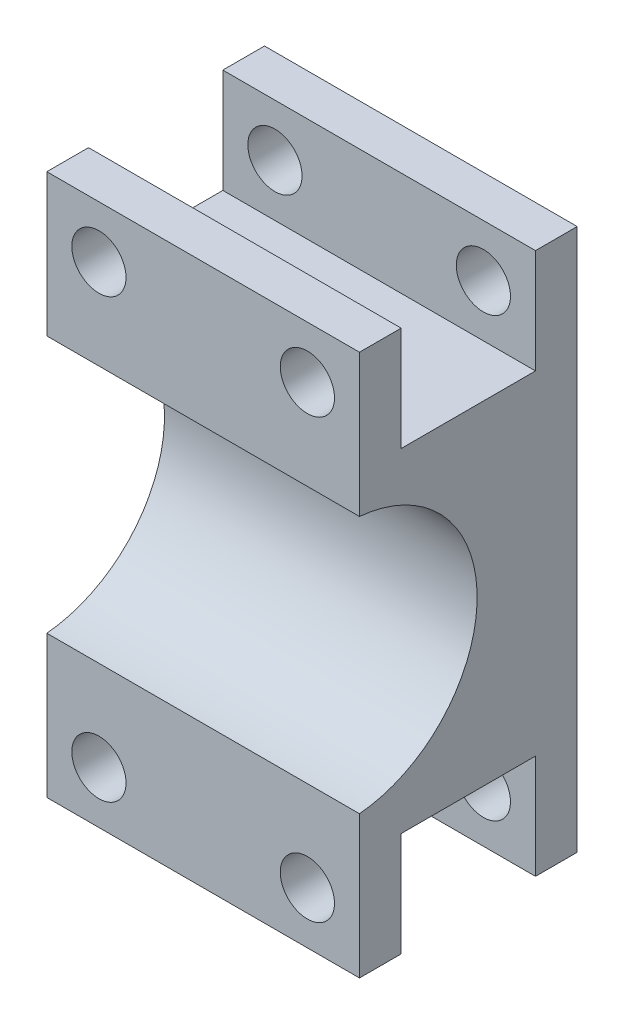
ISO-10303-21;
HEADER;
FILE_DESCRIPTION(('STEP AP214'),'2;1');
FILE_NAME('part.step','',(''),(''),'','','');
FILE_SCHEMA(('AUTOMOTIVE_DESIGN { 1 0 10303 214 1 1 1 1 }'));
ENDSEC;
DATA;
#1=APPLICATION_CONTEXT('core data for automotive mechanical design processes');
#2=APPLICATION_PROTOCOL_DEFINITION('international standard','automotive_design',2000,#1);
#3=PRODUCT_CONTEXT('',#1,'mechanical');
#4=PRODUCT('Part','Part','',(#3));
#5=PRODUCT_RELATED_PRODUCT_CATEGORY('part','',(#4));
#6=PRODUCT_DEFINITION_FORMATION('','',#4);
#7=PRODUCT_DEFINITION_CONTEXT('part definition',#1,'design');
#8=PRODUCT_DEFINITION('design','',#6,#7);
#9=PRODUCT_DEFINITION_SHAPE('','',#8);
#10=(LENGTH_UNIT() NAMED_UNIT(*) SI_UNIT(.MILLI.,.METRE.));
#11=(NAMED_UNIT(*) PLANE_ANGLE_UNIT() SI_UNIT($,.RADIAN.));
#12=(NAMED_UNIT(*) SI_UNIT($,.STERADIAN.) SOLID_ANGLE_UNIT());
#13=UNCERTAINTY_MEASURE_WITH_UNIT(LENGTH_MEASURE(1.E-05),#10,'distance_accuracy_value','');
#14=(GEOMETRIC_REPRESENTATION_CONTEXT(3) GLOBAL_UNCERTAINTY_ASSIGNED_CONTEXT((#13)) GLOBAL_UNIT_ASSIGNED_CONTEXT((#10,
#11,#12)) REPRESENTATION_CONTEXT('',''));
#15=CARTESIAN_POINT('',(0.,0.,0.));
#16=DIRECTION('',(0.,0.,1.));
#17=DIRECTION('',(1.,0.,0.));
#18=AXIS2_PLACEMENT_3D('',#15,#16,#17);
#19=CARTESIAN_POINT('',(0.,0.,6.99999999999999));
#20=DIRECTION('',(0.,1.,0.));
#21=DIRECTION('',(0.,0.,1.));
#22=AXIS2_PLACEMENT_3D('',#19,#20,#21);
#23=PLANE('',#22);
#24=DIRECTION('',(1.,0.,0.));
#25=VECTOR('',#24,1.);
#26=CARTESIAN_POINT('',(0.,0.,16.8875702269356));
#27=LINE('',#26,#25);
#28=CARTESIAN_POINT('',(0.,0.,16.8875702269356));
#29=VERTEX_POINT('',#28);
#30=CARTESIAN_POINT('',(30.,0.,16.8875702269356));
#31=VERTEX_POINT('',#30);
#32=EDGE_CURVE('E61',#29,#31,#27,.T.);
#33=ORIENTED_EDGE('',*,*,#32,.F.);
#34=DIRECTION('',(0.,0.,-1.));
#35=VECTOR('',#34,1.);
#36=CARTESIAN_POINT('',(0.,0.,6.99999999999999));
#37=LINE('',#36,#35);
#38=CARTESIAN_POINT('',(0.,0.,4.));
#39=VERTEX_POINT('',#38);
#40=EDGE_CURVE('E53',#29,#39,#37,.T.);
#41=ORIENTED_EDGE('',*,*,#40,.T.);
#42=DIRECTION('',(-1.,0.,0.));
#43=VECTOR('',#42,1.);
#44=CARTESIAN_POINT('',(0.,0.,4.));
#45=LINE('',#44,#43);
#46=CARTESIAN_POINT('',(30.,0.,4.));
#47=VERTEX_POINT('',#46);
#48=EDGE_CURVE('E261',#47,#39,#45,.T.);
#49=ORIENTED_EDGE('',*,*,#48,.F.);
#50=DIRECTION('',(0.,0.,-1.));
#51=VECTOR('',#50,1.);
#52=CARTESIAN_POINT('',(30.,0.,6.99999999999999));
#53=LINE('',#52,#51);
#54=EDGE_CURVE('E66',#31,#47,#53,.T.);
#55=ORIENTED_EDGE('',*,*,#54,.F.);
#56=EDGE_LOOP('',(#33,#41,#49,#55));
#57=FACE_BOUND('',#56,.T.);
#58=ADVANCED_FACE('F43',(#57),#23,.F.);
#59=CARTESIAN_POINT('',(30.,32.,6.99999999999999));
#60=DIRECTION('',(0.,-1.,0.));
#61=DIRECTION('',(0.,0.,-1.));
#62=AXIS2_PLACEMENT_3D('',#59,#60,#61);
#63=PLANE('',#62);
#64=DIRECTION('',(-1.,0.,0.));
#65=VECTOR('',#64,1.);
#66=CARTESIAN_POINT('',(0.,32.,16.8875702269356));
#67=LINE('',#66,#65);
#68=CARTESIAN_POINT('',(30.,32.,16.8875702269356));
#69=VERTEX_POINT('',#68);
#70=CARTESIAN_POINT('',(0.,32.,16.8875702269356));
#71=VERTEX_POINT('',#70);
#72=EDGE_CURVE('E170',#69,#71,#67,.T.);
#73=ORIENTED_EDGE('',*,*,#72,.F.);
#74=DIRECTION('',(0.,0.,-1.));
#75=VECTOR('',#74,1.);
#76=CARTESIAN_POINT('',(30.,32.,6.99999999999999));
#77=LINE('',#76,#75);
#78=CARTESIAN_POINT('',(30.,32.,4.));
#79=VERTEX_POINT('',#78);
#80=EDGE_CURVE('E312',#69,#79,#77,.T.);
#81=ORIENTED_EDGE('',*,*,#80,.T.);
#82=DIRECTION('',(1.,0.,0.));
#83=VECTOR('',#82,1.);
#84=CARTESIAN_POINT('',(30.,32.,4.));
#85=LINE('',#84,#83);
#86=CARTESIAN_POINT('',(0.,32.,4.));
#87=VERTEX_POINT('',#86);
#88=EDGE_CURVE('E11',#87,#79,#85,.T.);
#89=ORIENTED_EDGE('',*,*,#88,.F.);
#90=DIRECTION('',(0.,0.,-1.));
#91=VECTOR('',#90,1.);
#92=CARTESIAN_POINT('',(0.,32.,6.99999999999999));
#93=LINE('',#92,#91);
#94=EDGE_CURVE('E309',#71,#87,#93,.T.);
#95=ORIENTED_EDGE('',*,*,#94,.F.);
#96=EDGE_LOOP('',(#73,#81,#89,#95));
#97=FACE_BOUND('',#96,.T.);
#98=ADVANCED_FACE('F397',(#97),#63,.F.);
#99=CARTESIAN_POINT('',(0.,32.,6.99999999999999));
#100=DIRECTION('',(1.,0.,0.));
#101=DIRECTION('',(0.,0.,-1.));
#102=AXIS2_PLACEMENT_3D('',#99,#100,#101);
#103=PLANE('',#102);
#104=DIRECTION('',(0.,-1.,0.));
#105=VECTOR('',#104,1.);
#106=CARTESIAN_POINT('',(0.,32.,0.));
#107=LINE('',#106,#105);
#108=CARTESIAN_POINT('',(0.,42.,0.));
#109=VERTEX_POINT('',#108);
#110=CARTESIAN_POINT('',(0.,-10.,0.));
#111=VERTEX_POINT('',#110);
#112=EDGE_CURVE('E301',#109,#111,#107,.T.);
#113=ORIENTED_EDGE('',*,*,#112,.T.);
#114=DIRECTION('',(0.,0.,-1.));
#115=VECTOR('',#114,1.);
#116=CARTESIAN_POINT('',(0.,-10.,4.));
#117=LINE('',#116,#115);
#118=CARTESIAN_POINT('',(0.,-10.,4.));
#119=VERTEX_POINT('',#118);
#120=EDGE_CURVE('E266',#119,#111,#117,.T.);
#121=ORIENTED_EDGE('',*,*,#120,.F.);
#122=DIRECTION('',(0.,1.,0.));
#123=VECTOR('',#122,1.);
#124=CARTESIAN_POINT('',(0.,-10.,4.));
#125=LINE('',#124,#123);
#126=EDGE_CURVE('E242',#119,#39,#125,.T.);
#127=ORIENTED_EDGE('',*,*,#126,.T.);
#128=ORIENTED_EDGE('',*,*,#40,.F.);
#129=DIRECTION('',(0.,1.,0.));
#130=VECTOR('',#129,1.);
#131=CARTESIAN_POINT('',(0.,-10.,16.8875702269356));
#132=LINE('',#131,#130);
#133=CARTESIAN_POINT('',(0.,-10.,16.8875702269356));
#134=VERTEX_POINT('',#133);
#135=EDGE_CURVE('E149',#134,#29,#132,.T.);
#136=ORIENTED_EDGE('',*,*,#135,.F.);
#137=DIRECTION('',(0.,0.,-1.));
#138=VECTOR('',#137,1.);
#139=CARTESIAN_POINT('',(0.,-10.,20.8875702269356));
#140=LINE('',#139,#138);
#141=CARTESIAN_POINT('',(0.,-10.,20.8875702269356));
#142=VERTEX_POINT('',#141);
#143=EDGE_CURVE('E157',#142,#134,#140,.T.);
#144=ORIENTED_EDGE('',*,*,#143,.F.);
#145=DIRECTION('',(0.,1.,0.));
#146=VECTOR('',#145,1.);
#147=CARTESIAN_POINT('',(0.,3.65,20.8875702269356));
#148=LINE('',#147,#146);
#149=CARTESIAN_POINT('',(0.,3.65,20.8875702269356));
#150=VERTEX_POINT('',#149);
#151=EDGE_CURVE('E276',#142,#150,#148,.T.);
#152=ORIENTED_EDGE('',*,*,#151,.T.);
#153=CARTESIAN_POINT('',(0.,16.,22.));
#154=DIRECTION('',(1.,0.,0.));
#155=DIRECTION('',(0.,-1.,0.));
#156=AXIS2_PLACEMENT_3D('',#153,#154,#155);
#157=CIRCLE('',#156,12.4);
#158=CARTESIAN_POINT('',(0.,28.35,20.8875702269356));
#159=VERTEX_POINT('',#158);
#160=EDGE_CURVE('E292',#150,#159,#157,.T.);
#161=ORIENTED_EDGE('',*,*,#160,.T.);
#162=DIRECTION('',(0.,1.,0.));
#163=VECTOR('',#162,1.);
#164=CARTESIAN_POINT('',(0.,32.,20.8875702269356));
#165=LINE('',#164,#163);
#166=CARTESIAN_POINT('',(0.,42.,20.8875702269356));
#167=VERTEX_POINT('',#166);
#168=EDGE_CURVE('E282',#159,#167,#165,.T.);
#169=ORIENTED_EDGE('',*,*,#168,.T.);
#170=DIRECTION('',(0.,0.,1.));
#171=VECTOR('',#170,1.);
#172=CARTESIAN_POINT('',(0.,42.,20.8875702269356));
#173=LINE('',#172,#171);
#174=CARTESIAN_POINT('',(0.,42.,16.8875702269356));
#175=VERTEX_POINT('',#174);
#176=EDGE_CURVE('E174',#175,#167,#173,.T.);
#177=ORIENTED_EDGE('',*,*,#176,.F.);
#178=DIRECTION('',(0.,-1.,0.));
#179=VECTOR('',#178,1.);
#180=CARTESIAN_POINT('',(0.,42.,16.8875702269356));
#181=LINE('',#180,#179);
#182=EDGE_CURVE('E191',#175,#71,#181,.T.);
#183=ORIENTED_EDGE('',*,*,#182,.T.);
#184=ORIENTED_EDGE('',*,*,#94,.T.);
#185=CARTESIAN_POINT('',(0.,42.,4.));
#186=VERTEX_POINT('',#185);
#187=EDGE_CURVE('E241',#87,#186,#125,.T.);
#188=ORIENTED_EDGE('',*,*,#187,.T.);
#189=DIRECTION('',(0.,0.,-1.));
#190=VECTOR('',#189,1.);
#191=CARTESIAN_POINT('',(0.,42.,4.));
#192=LINE('',#191,#190);
#193=EDGE_CURVE('E262',#186,#109,#192,.T.);
#194=ORIENTED_EDGE('',*,*,#193,.T.);
#195=EDGE_LOOP('',(#113,#121,#127,#128,#136,#144,#152,#161,#169,#177,#183,#184,#188,#194));
#196=FACE_BOUND('',#195,.T.);
#197=ADVANCED_FACE('F45',(#196),#103,.F.);
#198=CARTESIAN_POINT('',(30.,0.,6.99999999999999));
#199=DIRECTION('',(-1.,0.,0.));
#200=DIRECTION('',(0.,0.,1.));
#201=AXIS2_PLACEMENT_3D('',#198,#199,#200);
#202=PLANE('',#201);
#203=DIRECTION('',(0.,1.,0.));
#204=VECTOR('',#203,1.);
#205=CARTESIAN_POINT('',(30.,0.,0.));
#206=LINE('',#205,#204);
#207=CARTESIAN_POINT('',(30.,-10.,0.));
#208=VERTEX_POINT('',#207);
#209=CARTESIAN_POINT('',(30.,42.,0.));
#210=VERTEX_POINT('',#209);
#211=EDGE_CURVE('E306',#208,#210,#206,.T.);
#212=ORIENTED_EDGE('',*,*,#211,.T.);
#213=DIRECTION('',(0.,0.,-1.));
#214=VECTOR('',#213,1.);
#215=CARTESIAN_POINT('',(30.,42.,4.));
#216=LINE('',#215,#214);
#217=CARTESIAN_POINT('',(30.,42.,4.));
#218=VERTEX_POINT('',#217);
#219=EDGE_CURVE('E257',#218,#210,#216,.T.);
#220=ORIENTED_EDGE('',*,*,#219,.F.);
#221=DIRECTION('',(0.,-1.,0.));
#222=VECTOR('',#221,1.);
#223=CARTESIAN_POINT('',(30.,42.,4.));
#224=LINE('',#223,#222);
#225=EDGE_CURVE('E232',#218,#79,#224,.T.);
#226=ORIENTED_EDGE('',*,*,#225,.T.);
#227=ORIENTED_EDGE('',*,*,#80,.F.);
#228=DIRECTION('',(0.,-1.,0.));
#229=VECTOR('',#228,1.);
#230=CARTESIAN_POINT('',(30.,42.,16.8875702269356));
#231=LINE('',#230,#229);
#232=CARTESIAN_POINT('',(30.,42.,16.8875702269356));
#233=VERTEX_POINT('',#232);
#234=EDGE_CURVE('E196',#233,#69,#231,.T.);
#235=ORIENTED_EDGE('',*,*,#234,.F.);
#236=DIRECTION('',(0.,0.,-1.));
#237=VECTOR('',#236,1.);
#238=CARTESIAN_POINT('',(30.,42.,16.8875702269356));
#239=LINE('',#238,#237);
#240=CARTESIAN_POINT('',(30.,42.,20.8875702269356));
#241=VERTEX_POINT('',#240);
#242=EDGE_CURVE('E186',#241,#233,#239,.T.);
#243=ORIENTED_EDGE('',*,*,#242,.F.);
#244=DIRECTION('',(0.,1.,0.));
#245=VECTOR('',#244,1.);
#246=CARTESIAN_POINT('',(30.,32.,20.8875702269356));
#247=LINE('',#246,#245);
#248=CARTESIAN_POINT('',(30.,28.35,20.8875702269356));
#249=VERTEX_POINT('',#248);
#250=EDGE_CURVE('E286',#249,#241,#247,.T.);
#251=ORIENTED_EDGE('',*,*,#250,.F.);
#252=CARTESIAN_POINT('',(30.,16.,22.));
#253=DIRECTION('',(1.,0.,0.));
#254=DIRECTION('',(0.,-1.,0.));
#255=AXIS2_PLACEMENT_3D('',#252,#253,#254);
#256=CIRCLE('',#255,12.4);
#257=CARTESIAN_POINT('',(30.,3.65,20.8875702269356));
#258=VERTEX_POINT('',#257);
#259=EDGE_CURVE('E281',#258,#249,#256,.T.);
#260=ORIENTED_EDGE('',*,*,#259,.F.);
#261=DIRECTION('',(0.,1.,0.));
#262=VECTOR('',#261,1.);
#263=CARTESIAN_POINT('',(30.,3.65,20.8875702269356));
#264=LINE('',#263,#262);
#265=CARTESIAN_POINT('',(30.,-10.,20.8875702269356));
#266=VERTEX_POINT('',#265);
#267=EDGE_CURVE('E277',#266,#258,#264,.T.);
#268=ORIENTED_EDGE('',*,*,#267,.F.);
#269=DIRECTION('',(0.,0.,1.));
#270=VECTOR('',#269,1.);
#271=CARTESIAN_POINT('',(30.,-10.,20.8875702269356));
#272=LINE('',#271,#270);
#273=CARTESIAN_POINT('',(30.,-10.,16.8875702269356));
#274=VERTEX_POINT('',#273);
#275=EDGE_CURVE('E156',#274,#266,#272,.T.);
#276=ORIENTED_EDGE('',*,*,#275,.F.);
#277=DIRECTION('',(0.,1.,0.));
#278=VECTOR('',#277,1.);
#279=CARTESIAN_POINT('',(30.,-10.,16.8875702269356));
#280=LINE('',#279,#278);
#281=EDGE_CURVE('E151',#274,#31,#280,.T.);
#282=ORIENTED_EDGE('',*,*,#281,.T.);
#283=ORIENTED_EDGE('',*,*,#54,.T.);
#284=CARTESIAN_POINT('',(30.,-10.,4.));
#285=VERTEX_POINT('',#284);
#286=EDGE_CURVE('E237',#47,#285,#224,.T.);
#287=ORIENTED_EDGE('',*,*,#286,.T.);
#288=DIRECTION('',(0.,0.,-1.));
#289=VECTOR('',#288,1.);
#290=CARTESIAN_POINT('',(30.,-10.,4.));
#291=LINE('',#290,#289);
#292=EDGE_CURVE('E249',#285,#208,#291,.T.);
#293=ORIENTED_EDGE('',*,*,#292,.T.);
#294=EDGE_LOOP('',(#212,#220,#226,#227,#235,#243,#251,#260,#268,#276,#282,#283,#287,#293));
#295=FACE_BOUND('',#294,.T.);
#296=ADVANCED_FACE('F377',(#295),#202,.F.);
#297=CARTESIAN_POINT('',(0.,0.,0.));
#298=DIRECTION('',(0.,0.,1.));
#299=DIRECTION('',(1.,0.,0.));
#300=AXIS2_PLACEMENT_3D('',#297,#298,#299);
#301=PLANE('',#300);
#302=ORIENTED_EDGE('',*,*,#112,.F.);
#303=DIRECTION('',(1.,0.,0.));
#304=VECTOR('',#303,1.);
#305=CARTESIAN_POINT('',(0.,42.,0.));
#306=LINE('',#305,#304);
#307=EDGE_CURVE('E253',#109,#210,#306,.T.);
#308=ORIENTED_EDGE('',*,*,#307,.T.);
#309=ORIENTED_EDGE('',*,*,#211,.F.);
#310=DIRECTION('',(-1.,0.,0.));
#311=VECTOR('',#310,1.);
#312=CARTESIAN_POINT('',(30.,-10.,0.));
#313=LINE('',#312,#311);
#314=EDGE_CURVE('E228',#208,#111,#313,.T.);
#315=ORIENTED_EDGE('',*,*,#314,.T.);
#316=EDGE_LOOP('',(#302,#308,#309,#315));
#317=FACE_BOUND('',#316,.T.);
#318=CARTESIAN_POINT('',(25.,37.,0.));
#319=DIRECTION('',(0.,0.,-1.));
#320=DIRECTION('',(-1.,0.,0.));
#321=AXIS2_PLACEMENT_3D('',#318,#319,#320);
#322=CIRCLE('',#321,2.6);
#323=CARTESIAN_POINT('',(22.4,37.,0.));
#324=VERTEX_POINT('',#323);
#325=EDGE_CURVE('E220',#324,#324,#322,.T.);
#326=ORIENTED_EDGE('',*,*,#325,.F.);
#327=EDGE_LOOP('',(#326));
#328=FACE_BOUND('',#327,.T.);
#329=CARTESIAN_POINT('',(5.,37.,0.));
#330=DIRECTION('',(0.,0.,-1.));
#331=DIRECTION('',(-1.,0.,0.));
#332=AXIS2_PLACEMENT_3D('',#329,#330,#331);
#333=CIRCLE('',#332,2.6);
#334=CARTESIAN_POINT('',(2.4,37.,0.));
#335=VERTEX_POINT('',#334);
#336=EDGE_CURVE('E212',#335,#335,#333,.T.);
#337=ORIENTED_EDGE('',*,*,#336,.F.);
#338=EDGE_LOOP('',(#337));
#339=FACE_BOUND('',#338,.T.);
#340=CARTESIAN_POINT('',(5.,-5.,0.));
#341=DIRECTION('',(0.,0.,-1.));
#342=DIRECTION('',(-1.,0.,0.));
#343=AXIS2_PLACEMENT_3D('',#340,#341,#342);
#344=CIRCLE('',#343,2.60000000000001);
#345=CARTESIAN_POINT('',(2.39999999999999,-5.,0.));
#346=VERTEX_POINT('',#345);
#347=EDGE_CURVE('E204',#346,#346,#344,.T.);
#348=ORIENTED_EDGE('',*,*,#347,.F.);
#349=EDGE_LOOP('',(#348));
#350=FACE_BOUND('',#349,.T.);
#351=CARTESIAN_POINT('',(25.,-5.,0.));
#352=DIRECTION('',(0.,0.,-1.));
#353=DIRECTION('',(-1.,0.,0.));
#354=AXIS2_PLACEMENT_3D('',#351,#352,#353);
#355=CIRCLE('',#354,2.60000000000001);
#356=CARTESIAN_POINT('',(22.4,-5.,0.));
#357=VERTEX_POINT('',#356);
#358=EDGE_CURVE('E199',#357,#357,#355,.T.);
#359=ORIENTED_EDGE('',*,*,#358,.F.);
#360=EDGE_LOOP('',(#359));
#361=FACE_BOUND('',#360,.T.);
#362=ADVANCED_FACE('F365',(#317,#328,#339,#350,#361),#301,.F.);
#363=CARTESIAN_POINT('',(30.,32.,20.8875702269356));
#364=DIRECTION('',(0.,0.,1.));
#365=DIRECTION('',(1.,0.,0.));
#366=AXIS2_PLACEMENT_3D('',#363,#364,#365);
#367=PLANE('',#366);
#368=CARTESIAN_POINT('',(25.,37.,20.8875702269356));
#369=DIRECTION('',(0.,0.,1.));
#370=DIRECTION('',(1.,0.,0.));
#371=AXIS2_PLACEMENT_3D('',#368,#369,#370);
#372=CIRCLE('',#371,2.6);
#373=CARTESIAN_POINT('',(27.6,37.,20.8875702269356));
#374=VERTEX_POINT('',#373);
#375=EDGE_CURVE('E345',#374,#374,#372,.T.);
#376=ORIENTED_EDGE('',*,*,#375,.F.);
#377=EDGE_LOOP('',(#376));
#378=FACE_BOUND('',#377,.T.);
#379=CARTESIAN_POINT('',(5.,37.,20.8875702269356));
#380=DIRECTION('',(0.,0.,1.));
#381=DIRECTION('',(1.,0.,0.));
#382=AXIS2_PLACEMENT_3D('',#379,#380,#381);
#383=CIRCLE('',#382,2.6);
#384=CARTESIAN_POINT('',(7.6,37.,20.8875702269356));
#385=VERTEX_POINT('',#384);
#386=EDGE_CURVE('E324',#385,#385,#383,.T.);
#387=ORIENTED_EDGE('',*,*,#386,.F.);
#388=EDGE_LOOP('',(#387));
#389=FACE_BOUND('',#388,.T.);
#390=ORIENTED_EDGE('',*,*,#168,.F.);
#391=DIRECTION('',(-1.,0.,0.));
#392=VECTOR('',#391,1.);
#393=CARTESIAN_POINT('',(30.,28.35,20.8875702269356));
#394=LINE('',#393,#392);
#395=EDGE_CURVE('E298',#249,#159,#394,.T.);
#396=ORIENTED_EDGE('',*,*,#395,.F.);
#397=ORIENTED_EDGE('',*,*,#250,.T.);
#398=DIRECTION('',(1.,0.,0.));
#399=VECTOR('',#398,1.);
#400=CARTESIAN_POINT('',(30.,42.,20.8875702269356));
#401=LINE('',#400,#399);
#402=EDGE_CURVE('E182',#167,#241,#401,.T.);
#403=ORIENTED_EDGE('',*,*,#402,.F.);
#404=EDGE_LOOP('',(#390,#396,#397,#403));
#405=FACE_BOUND('',#404,.T.);
#406=ADVANCED_FACE('F361',(#378,#389,#405),#367,.T.);
#407=CARTESIAN_POINT('',(30.,16.,22.));
#408=DIRECTION('',(-1.,0.,0.));
#409=DIRECTION('',(0.,-1.,0.));
#410=AXIS2_PLACEMENT_3D('',#407,#408,#409);
#411=CYLINDRICAL_SURFACE('',#410,12.4);
#412=ORIENTED_EDGE('',*,*,#160,.F.);
#413=DIRECTION('',(-1.,0.,0.));
#414=VECTOR('',#413,1.);
#415=CARTESIAN_POINT('',(30.,3.65,20.8875702269356));
#416=LINE('',#415,#414);
#417=EDGE_CURVE('E289',#258,#150,#416,.T.);
#418=ORIENTED_EDGE('',*,*,#417,.F.);
#419=ORIENTED_EDGE('',*,*,#259,.T.);
#420=ORIENTED_EDGE('',*,*,#395,.T.);
#421=EDGE_LOOP('',(#412,#418,#419,#420));
#422=FACE_BOUND('',#421,.T.);
#423=ADVANCED_FACE('F364',(#422),#411,.F.);
#424=CARTESIAN_POINT('',(30.,3.65,20.8875702269356));
#425=DIRECTION('',(0.,0.,1.));
#426=DIRECTION('',(1.,0.,0.));
#427=AXIS2_PLACEMENT_3D('',#424,#425,#426);
#428=PLANE('',#427);
#429=CARTESIAN_POINT('',(5.,-5.00000000000002,20.8875702269356));
#430=DIRECTION('',(0.,0.,1.));
#431=DIRECTION('',(1.,0.,0.));
#432=AXIS2_PLACEMENT_3D('',#429,#430,#431);
#433=CIRCLE('',#432,2.6);
#434=CARTESIAN_POINT('',(7.6,-5.00000000000002,20.8875702269356));
#435=VERTEX_POINT('',#434);
#436=EDGE_CURVE('E346',#435,#435,#433,.T.);
#437=ORIENTED_EDGE('',*,*,#436,.F.);
#438=EDGE_LOOP('',(#437));
#439=FACE_BOUND('',#438,.T.);
#440=CARTESIAN_POINT('',(25.,-5.,20.8875702269356));
#441=DIRECTION('',(0.,0.,1.));
#442=DIRECTION('',(1.,0.,0.));
#443=AXIS2_PLACEMENT_3D('',#440,#441,#442);
#444=CIRCLE('',#443,2.6);
#445=CARTESIAN_POINT('',(27.6,-5.,20.8875702269356));
#446=VERTEX_POINT('',#445);
#447=EDGE_CURVE('E350',#446,#446,#444,.T.);
#448=ORIENTED_EDGE('',*,*,#447,.F.);
#449=EDGE_LOOP('',(#448));
#450=FACE_BOUND('',#449,.T.);
#451=ORIENTED_EDGE('',*,*,#151,.F.);
#452=DIRECTION('',(-1.,0.,0.));
#453=VECTOR('',#452,1.);
#454=CARTESIAN_POINT('',(0.,-10.,20.8875702269356));
#455=LINE('',#454,#453);
#456=EDGE_CURVE('E163',#266,#142,#455,.T.);
#457=ORIENTED_EDGE('',*,*,#456,.F.);
#458=ORIENTED_EDGE('',*,*,#267,.T.);
#459=ORIENTED_EDGE('',*,*,#417,.T.);
#460=EDGE_LOOP('',(#451,#457,#458,#459));
#461=FACE_BOUND('',#460,.T.);
#462=ADVANCED_FACE('F380',(#439,#450,#461),#428,.T.);
#463=CARTESIAN_POINT('',(0.,42.,4.));
#464=DIRECTION('',(0.,1.,0.));
#465=DIRECTION('',(-1.,0.,0.));
#466=AXIS2_PLACEMENT_3D('',#463,#464,#465);
#467=PLANE('',#466);
#468=ORIENTED_EDGE('',*,*,#307,.F.);
#469=ORIENTED_EDGE('',*,*,#193,.F.);
#470=DIRECTION('',(1.,0.,0.));
#471=VECTOR('',#470,1.);
#472=CARTESIAN_POINT('',(0.,42.,4.));
#473=LINE('',#472,#471);
#474=EDGE_CURVE('E245',#186,#218,#473,.T.);
#475=ORIENTED_EDGE('',*,*,#474,.T.);
#476=ORIENTED_EDGE('',*,*,#219,.T.);
#477=EDGE_LOOP('',(#468,#469,#475,#476));
#478=FACE_BOUND('',#477,.T.);
#479=ADVANCED_FACE('F382',(#478),#467,.T.);
#480=CARTESIAN_POINT('',(5.,37.,4.));
#481=DIRECTION('',(0.,0.,-1.));
#482=DIRECTION('',(-1.,0.,0.));
#483=AXIS2_PLACEMENT_3D('',#480,#481,#482);
#484=CYLINDRICAL_SURFACE('',#483,2.6);
#485=CARTESIAN_POINT('',(5.,37.,4.));
#486=DIRECTION('',(0.,0.,-1.));
#487=DIRECTION('',(-1.,0.,0.));
#488=AXIS2_PLACEMENT_3D('',#485,#486,#487);
#489=CIRCLE('',#488,2.6);
#490=CARTESIAN_POINT('',(2.4,37.,4.));
#491=VERTEX_POINT('',#490);
#492=EDGE_CURVE('E216',#491,#491,#489,.T.);
#493=ORIENTED_EDGE('',*,*,#492,.F.);
#494=EDGE_LOOP('',(#493));
#495=FACE_BOUND('',#494,.T.);
#496=ORIENTED_EDGE('',*,*,#336,.T.);
#497=EDGE_LOOP('',(#496));
#498=FACE_BOUND('',#497,.T.);
#499=ADVANCED_FACE('F389',(#495,#498),#484,.F.);
#500=CARTESIAN_POINT('',(25.,37.,4.));
#501=DIRECTION('',(0.,0.,-1.));
#502=DIRECTION('',(-1.,0.,0.));
#503=AXIS2_PLACEMENT_3D('',#500,#501,#502);
#504=CYLINDRICAL_SURFACE('',#503,2.6);
#505=CARTESIAN_POINT('',(25.,37.,4.));
#506=DIRECTION('',(0.,0.,-1.));
#507=DIRECTION('',(-1.,0.,0.));
#508=AXIS2_PLACEMENT_3D('',#505,#506,#507);
#509=CIRCLE('',#508,2.6);
#510=CARTESIAN_POINT('',(22.4,37.,4.));
#511=VERTEX_POINT('',#510);
#512=EDGE_CURVE('E224',#511,#511,#509,.T.);
#513=ORIENTED_EDGE('',*,*,#512,.F.);
#514=EDGE_LOOP('',(#513));
#515=FACE_BOUND('',#514,.T.);
#516=ORIENTED_EDGE('',*,*,#325,.T.);
#517=EDGE_LOOP('',(#516));
#518=FACE_BOUND('',#517,.T.);
#519=ADVANCED_FACE('F438',(#515,#518),#504,.F.);
#520=CARTESIAN_POINT('',(0.,0.,4.));
#521=DIRECTION('',(0.,0.,-1.));
#522=DIRECTION('',(-1.,0.,0.));
#523=AXIS2_PLACEMENT_3D('',#520,#521,#522);
#524=PLANE('',#523);
#525=ORIENTED_EDGE('',*,*,#512,.T.);
#526=EDGE_LOOP('',(#525));
#527=FACE_BOUND('',#526,.T.);
#528=ORIENTED_EDGE('',*,*,#492,.T.);
#529=EDGE_LOOP('',(#528));
#530=FACE_BOUND('',#529,.T.);
#531=ORIENTED_EDGE('',*,*,#187,.F.);
#532=ORIENTED_EDGE('',*,*,#88,.T.);
#533=ORIENTED_EDGE('',*,*,#225,.F.);
#534=ORIENTED_EDGE('',*,*,#474,.F.);
#535=EDGE_LOOP('',(#531,#532,#533,#534));
#536=FACE_BOUND('',#535,.T.);
#537=ADVANCED_FACE('F442',(#527,#530,#536),#524,.F.);
#538=CARTESIAN_POINT('',(25.,-5.,4.));
#539=DIRECTION('',(0.,0.,-1.));
#540=DIRECTION('',(-1.,0.,0.));
#541=AXIS2_PLACEMENT_3D('',#538,#539,#540);
#542=CIRCLE('',#541,2.60000000000001);
#543=CARTESIAN_POINT('',(22.4,-5.,4.));
#544=VERTEX_POINT('',#543);
#545=EDGE_CURVE('E200',#544,#544,#542,.T.);
#546=ORIENTED_EDGE('',*,*,#545,.T.);
#547=EDGE_LOOP('',(#546));
#548=FACE_BOUND('',#547,.T.);
#549=CARTESIAN_POINT('',(5.,-5.,4.));
#550=DIRECTION('',(0.,0.,-1.));
#551=DIRECTION('',(-1.,0.,0.));
#552=AXIS2_PLACEMENT_3D('',#549,#550,#551);
#553=CIRCLE('',#552,2.60000000000001);
#554=CARTESIAN_POINT('',(2.39999999999999,-5.,4.));
#555=VERTEX_POINT('',#554);
#556=EDGE_CURVE('E208',#555,#555,#553,.T.);
#557=ORIENTED_EDGE('',*,*,#556,.T.);
#558=EDGE_LOOP('',(#557));
#559=FACE_BOUND('',#558,.T.);
#560=ORIENTED_EDGE('',*,*,#286,.F.);
#561=ORIENTED_EDGE('',*,*,#48,.T.);
#562=ORIENTED_EDGE('',*,*,#126,.F.);
#563=DIRECTION('',(-1.,0.,0.));
#564=VECTOR('',#563,1.);
#565=CARTESIAN_POINT('',(30.,-10.,4.));
#566=LINE('',#565,#564);
#567=EDGE_CURVE('E236',#285,#119,#566,.T.);
#568=ORIENTED_EDGE('',*,*,#567,.F.);
#569=EDGE_LOOP('',(#560,#561,#562,#568));
#570=FACE_BOUND('',#569,.T.);
#571=ADVANCED_FACE('F444',(#548,#559,#570),#524,.F.);
#572=CARTESIAN_POINT('',(30.,-10.,4.));
#573=DIRECTION('',(0.,-1.,0.));
#574=DIRECTION('',(0.,0.,-1.));
#575=AXIS2_PLACEMENT_3D('',#572,#573,#574);
#576=PLANE('',#575);
#577=ORIENTED_EDGE('',*,*,#314,.F.);
#578=ORIENTED_EDGE('',*,*,#292,.F.);
#579=ORIENTED_EDGE('',*,*,#567,.T.);
#580=ORIENTED_EDGE('',*,*,#120,.T.);
#581=EDGE_LOOP('',(#577,#578,#579,#580));
#582=FACE_BOUND('',#581,.T.);
#583=ADVANCED_FACE('F430',(#582),#576,.T.);
#584=CARTESIAN_POINT('',(5.,-5.,4.));
#585=DIRECTION('',(0.,0.,-1.));
#586=DIRECTION('',(-1.,0.,0.));
#587=AXIS2_PLACEMENT_3D('',#584,#585,#586);
#588=CYLINDRICAL_SURFACE('',#587,2.60000000000001);
#589=ORIENTED_EDGE('',*,*,#556,.F.);
#590=EDGE_LOOP('',(#589));
#591=FACE_BOUND('',#590,.T.);
#592=ORIENTED_EDGE('',*,*,#347,.T.);
#593=EDGE_LOOP('',(#592));
#594=FACE_BOUND('',#593,.T.);
#595=ADVANCED_FACE('F421',(#591,#594),#588,.F.);
#596=CARTESIAN_POINT('',(25.,-5.,4.));
#597=DIRECTION('',(0.,0.,-1.));
#598=DIRECTION('',(-1.,0.,0.));
#599=AXIS2_PLACEMENT_3D('',#596,#597,#598);
#600=CYLINDRICAL_SURFACE('',#599,2.60000000000001);
#601=ORIENTED_EDGE('',*,*,#545,.F.);
#602=EDGE_LOOP('',(#601));
#603=FACE_BOUND('',#602,.T.);
#604=ORIENTED_EDGE('',*,*,#358,.T.);
#605=EDGE_LOOP('',(#604));
#606=FACE_BOUND('',#605,.T.);
#607=ADVANCED_FACE('F418',(#603,#606),#600,.F.);
#608=CARTESIAN_POINT('',(0.,42.,16.8875702269356));
#609=DIRECTION('',(0.,0.,1.));
#610=DIRECTION('',(1.,0.,0.));
#611=AXIS2_PLACEMENT_3D('',#608,#609,#610);
#612=PLANE('',#611);
#613=CARTESIAN_POINT('',(25.,37.,16.8875702269356));
#614=DIRECTION('',(0.,0.,1.));
#615=DIRECTION('',(1.,0.,0.));
#616=AXIS2_PLACEMENT_3D('',#613,#614,#615);
#617=CIRCLE('',#616,2.6);
#618=CARTESIAN_POINT('',(27.6,37.,16.8875702269356));
#619=VERTEX_POINT('',#618);
#620=EDGE_CURVE('E47',#619,#619,#617,.T.);
#621=ORIENTED_EDGE('',*,*,#620,.T.);
#622=EDGE_LOOP('',(#621));
#623=FACE_BOUND('',#622,.T.);
#624=CARTESIAN_POINT('',(5.,37.,16.8875702269356));
#625=DIRECTION('',(0.,0.,1.));
#626=DIRECTION('',(1.,0.,0.));
#627=AXIS2_PLACEMENT_3D('',#624,#625,#626);
#628=CIRCLE('',#627,2.6);
#629=CARTESIAN_POINT('',(7.6,37.,16.8875702269356));
#630=VERTEX_POINT('',#629);
#631=EDGE_CURVE('E327',#630,#630,#628,.T.);
#632=ORIENTED_EDGE('',*,*,#631,.T.);
#633=EDGE_LOOP('',(#632));
#634=FACE_BOUND('',#633,.T.);
#635=ORIENTED_EDGE('',*,*,#72,.T.);
#636=ORIENTED_EDGE('',*,*,#182,.F.);
#637=DIRECTION('',(-1.,0.,0.));
#638=VECTOR('',#637,1.);
#639=CARTESIAN_POINT('',(0.,42.,16.8875702269356));
#640=LINE('',#639,#638);
#641=EDGE_CURVE('E189',#233,#175,#640,.T.);
#642=ORIENTED_EDGE('',*,*,#641,.F.);
#643=ORIENTED_EDGE('',*,*,#234,.T.);
#644=EDGE_LOOP('',(#635,#636,#642,#643));
#645=FACE_BOUND('',#644,.T.);
#646=ADVANCED_FACE('F420',(#623,#634,#645),#612,.F.);
#647=CARTESIAN_POINT('',(0.,42.,0.));
#648=DIRECTION('',(0.,-1.,0.));
#649=DIRECTION('',(0.,0.,-1.));
#650=AXIS2_PLACEMENT_3D('',#647,#648,#649);
#651=PLANE('',#650);
#652=ORIENTED_EDGE('',*,*,#176,.T.);
#653=ORIENTED_EDGE('',*,*,#402,.T.);
#654=ORIENTED_EDGE('',*,*,#242,.T.);
#655=ORIENTED_EDGE('',*,*,#641,.T.);
#656=EDGE_LOOP('',(#652,#653,#654,#655));
#657=FACE_BOUND('',#656,.T.);
#658=ADVANCED_FACE('F428',(#657),#651,.F.);
#659=CARTESIAN_POINT('',(0.,-10.,16.8875702269356));
#660=DIRECTION('',(0.,0.,1.));
#661=DIRECTION('',(1.,0.,0.));
#662=AXIS2_PLACEMENT_3D('',#659,#660,#661);
#663=PLANE('',#662);
#664=CARTESIAN_POINT('',(5.,-5.00000000000002,16.8875702269356));
#665=DIRECTION('',(0.,0.,1.));
#666=DIRECTION('',(1.,0.,0.));
#667=AXIS2_PLACEMENT_3D('',#664,#665,#666);
#668=CIRCLE('',#667,2.6);
#669=CARTESIAN_POINT('',(7.6,-5.00000000000002,16.8875702269356));
#670=VERTEX_POINT('',#669);
#671=EDGE_CURVE('E323',#670,#670,#668,.T.);
#672=ORIENTED_EDGE('',*,*,#671,.T.);
#673=EDGE_LOOP('',(#672));
#674=FACE_BOUND('',#673,.T.);
#675=CARTESIAN_POINT('',(25.,-5.,16.8875702269356));
#676=DIRECTION('',(0.,0.,1.));
#677=DIRECTION('',(1.,0.,0.));
#678=AXIS2_PLACEMENT_3D('',#675,#676,#677);
#679=CIRCLE('',#678,2.6);
#680=CARTESIAN_POINT('',(27.6,-5.,16.8875702269356));
#681=VERTEX_POINT('',#680);
#682=EDGE_CURVE('E319',#681,#681,#679,.T.);
#683=ORIENTED_EDGE('',*,*,#682,.T.);
#684=EDGE_LOOP('',(#683));
#685=FACE_BOUND('',#684,.T.);
#686=ORIENTED_EDGE('',*,*,#32,.T.);
#687=ORIENTED_EDGE('',*,*,#281,.F.);
#688=DIRECTION('',(1.,0.,0.));
#689=VECTOR('',#688,1.);
#690=CARTESIAN_POINT('',(0.,-10.,16.8875702269356));
#691=LINE('',#690,#689);
#692=EDGE_CURVE('E145',#134,#274,#691,.T.);
#693=ORIENTED_EDGE('',*,*,#692,.F.);
#694=ORIENTED_EDGE('',*,*,#135,.T.);
#695=EDGE_LOOP('',(#686,#687,#693,#694));
#696=FACE_BOUND('',#695,.T.);
#697=ADVANCED_FACE('F147',(#674,#685,#696),#663,.F.);
#698=CARTESIAN_POINT('',(0.,-10.,0.));
#699=DIRECTION('',(0.,-1.,0.));
#700=DIRECTION('',(0.,0.,-1.));
#701=AXIS2_PLACEMENT_3D('',#698,#699,#700);
#702=PLANE('',#701);
#703=ORIENTED_EDGE('',*,*,#143,.T.);
#704=ORIENTED_EDGE('',*,*,#692,.T.);
#705=ORIENTED_EDGE('',*,*,#275,.T.);
#706=ORIENTED_EDGE('',*,*,#456,.T.);
#707=EDGE_LOOP('',(#703,#704,#705,#706));
#708=FACE_BOUND('',#707,.T.);
#709=ADVANCED_FACE('F161',(#708),#702,.T.);
#710=CARTESIAN_POINT('',(25.,-5.,10.8875702269356));
#711=DIRECTION('',(0.,0.,1.));
#712=DIRECTION('',(1.,0.,0.));
#713=AXIS2_PLACEMENT_3D('',#710,#711,#712);
#714=CYLINDRICAL_SURFACE('',#713,2.6);
#715=ORIENTED_EDGE('',*,*,#447,.T.);
#716=EDGE_LOOP('',(#715));
#717=FACE_BOUND('',#716,.T.);
#718=ORIENTED_EDGE('',*,*,#682,.F.);
#719=EDGE_LOOP('',(#718));
#720=FACE_BOUND('',#719,.T.);
#721=ADVANCED_FACE('F483',(#717,#720),#714,.F.);
#722=CARTESIAN_POINT('',(5.,-5.00000000000002,10.8875702269356));
#723=DIRECTION('',(0.,0.,1.));
#724=DIRECTION('',(1.,0.,0.));
#725=AXIS2_PLACEMENT_3D('',#722,#723,#724);
#726=CYLINDRICAL_SURFACE('',#725,2.6);
#727=ORIENTED_EDGE('',*,*,#436,.T.);
#728=EDGE_LOOP('',(#727));
#729=FACE_BOUND('',#728,.T.);
#730=ORIENTED_EDGE('',*,*,#671,.F.);
#731=EDGE_LOOP('',(#730));
#732=FACE_BOUND('',#731,.T.);
#733=ADVANCED_FACE('F487',(#729,#732),#726,.F.);
#734=CARTESIAN_POINT('',(5.,37.,10.8875702269356));
#735=DIRECTION('',(0.,0.,1.));
#736=DIRECTION('',(1.,0.,0.));
#737=AXIS2_PLACEMENT_3D('',#734,#735,#736);
#738=CYLINDRICAL_SURFACE('',#737,2.6);
#739=ORIENTED_EDGE('',*,*,#386,.T.);
#740=EDGE_LOOP('',(#739));
#741=FACE_BOUND('',#740,.T.);
#742=ORIENTED_EDGE('',*,*,#631,.F.);
#743=EDGE_LOOP('',(#742));
#744=FACE_BOUND('',#743,.T.);
#745=ADVANCED_FACE('F484',(#741,#744),#738,.F.);
#746=CARTESIAN_POINT('',(25.,37.,10.8875702269356));
#747=DIRECTION('',(0.,0.,1.));
#748=DIRECTION('',(1.,0.,0.));
#749=AXIS2_PLACEMENT_3D('',#746,#747,#748);
#750=CYLINDRICAL_SURFACE('',#749,2.6);
#751=ORIENTED_EDGE('',*,*,#375,.T.);
#752=EDGE_LOOP('',(#751));
#753=FACE_BOUND('',#752,.T.);
#754=ORIENTED_EDGE('',*,*,#620,.F.);
#755=EDGE_LOOP('',(#754));
#756=FACE_BOUND('',#755,.T.);
#757=ADVANCED_FACE('F358',(#753,#756),#750,.F.);
#758=CLOSED_SHELL('',(#58,#98,#197,#296,#362,#406,#423,#462,#479,#499,#519,#537,#571,#583,#595,
#607,#646,#658,#697,#709,#721,#733,#745,#757));
#759=MANIFOLD_SOLID_BREP('B2',#758);
#760=ADVANCED_BREP_SHAPE_REPRESENTATION('',(#18,#759),#14);
#761=SHAPE_DEFINITION_REPRESENTATION(#9,#760);
ENDSEC;
END-ISO-10303-21;
